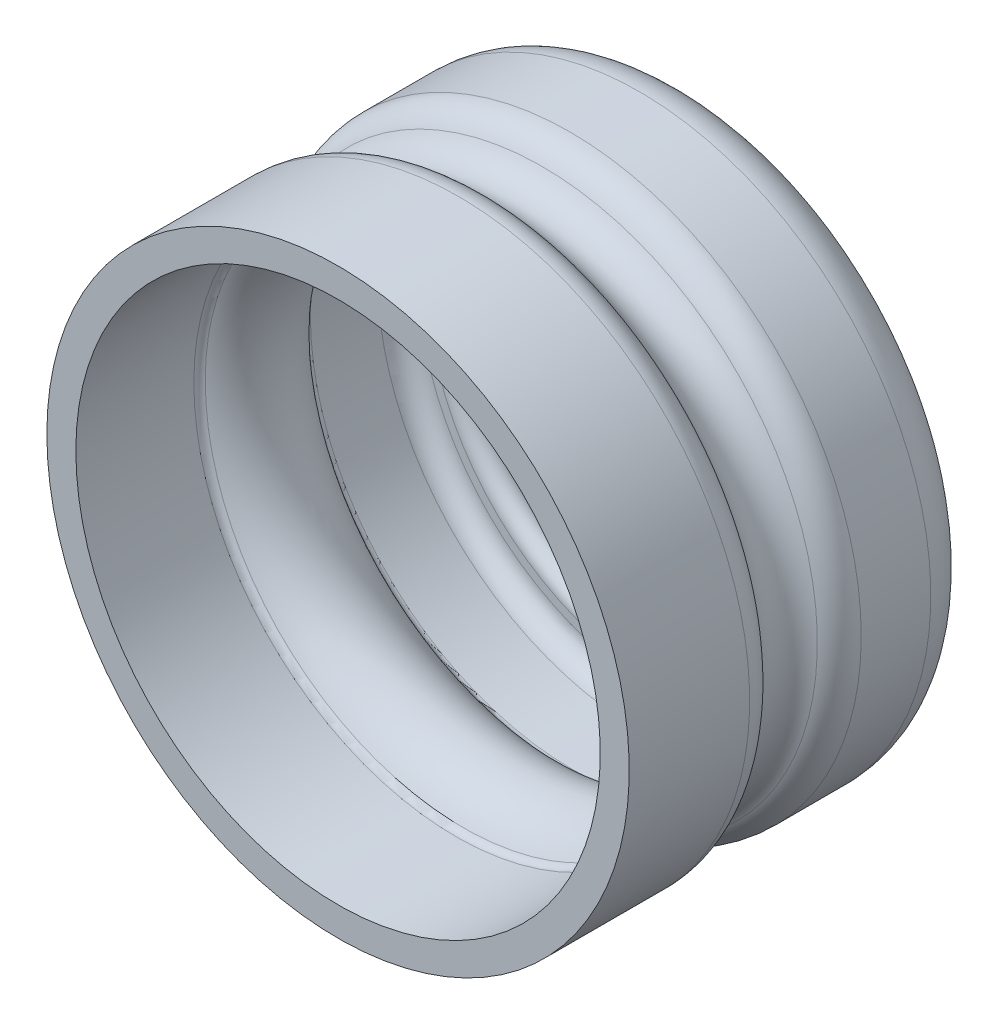
ISO-10303-21;
HEADER;
FILE_DESCRIPTION(('STEP AP214'),'2;1');
FILE_NAME('part.step','',(''),(''),'','','');
FILE_SCHEMA(('AUTOMOTIVE_DESIGN { 1 0 10303 214 1 1 1 1 }'));
ENDSEC;
DATA;
#1=APPLICATION_CONTEXT('core data for automotive mechanical design processes');
#2=APPLICATION_PROTOCOL_DEFINITION('international standard','automotive_design',2000,#1);
#3=PRODUCT_CONTEXT('',#1,'mechanical');
#4=PRODUCT('Part','Part','',(#3));
#5=PRODUCT_RELATED_PRODUCT_CATEGORY('part','',(#4));
#6=PRODUCT_DEFINITION_FORMATION('','',#4);
#7=PRODUCT_DEFINITION_CONTEXT('part definition',#1,'design');
#8=PRODUCT_DEFINITION('design','',#6,#7);
#9=PRODUCT_DEFINITION_SHAPE('','',#8);
#10=(LENGTH_UNIT() NAMED_UNIT(*) SI_UNIT(.MILLI.,.METRE.));
#11=(NAMED_UNIT(*) PLANE_ANGLE_UNIT() SI_UNIT($,.RADIAN.));
#12=(NAMED_UNIT(*) SI_UNIT($,.STERADIAN.) SOLID_ANGLE_UNIT());
#13=UNCERTAINTY_MEASURE_WITH_UNIT(LENGTH_MEASURE(1.E-05),#10,'distance_accuracy_value','');
#14=(GEOMETRIC_REPRESENTATION_CONTEXT(3) GLOBAL_UNCERTAINTY_ASSIGNED_CONTEXT((#13)) GLOBAL_UNIT_ASSIGNED_CONTEXT((#10,
#11,#12)) REPRESENTATION_CONTEXT('',''));
#15=CARTESIAN_POINT('',(0.,0.,0.));
#16=DIRECTION('',(0.,0.,1.));
#17=DIRECTION('',(1.,0.,0.));
#18=AXIS2_PLACEMENT_3D('',#15,#16,#17);
#19=CARTESIAN_POINT('',(0.83,0.,-1.15));
#20=DIRECTION('',(0.,0.,-1.));
#21=DIRECTION('',(-1.,0.,0.));
#22=AXIS2_PLACEMENT_3D('',#19,#20,#21);
#23=PLANE('',#22);
#24=CARTESIAN_POINT('',(0.,0.,-1.15));
#25=DIRECTION('',(0.,0.,-1.));
#26=DIRECTION('',(-1.,0.,0.));
#27=AXIS2_PLACEMENT_3D('',#24,#25,#26);
#28=CIRCLE('',#27,0.83);
#29=CARTESIAN_POINT('',(-0.83,0.,-1.15));
#30=VERTEX_POINT('',#29);
#31=EDGE_CURVE('E64',#30,#30,#28,.F.);
#32=ORIENTED_EDGE('',*,*,#31,.T.);
#33=EDGE_LOOP('',(#32));
#34=FACE_BOUND('',#33,.T.);
#35=CARTESIAN_POINT('',(0.,0.,-1.15));
#36=DIRECTION('',(0.,0.,-1.));
#37=DIRECTION('',(-1.,0.,0.));
#38=AXIS2_PLACEMENT_3D('',#35,#36,#37);
#39=CIRCLE('',#38,0.8);
#40=CARTESIAN_POINT('',(-0.8,0.,-1.15));
#41=VERTEX_POINT('',#40);
#42=EDGE_CURVE('E18',#41,#41,#39,.F.);
#43=ORIENTED_EDGE('',*,*,#42,.F.);
#44=EDGE_LOOP('',(#43));
#45=FACE_BOUND('',#44,.T.);
#46=ADVANCED_FACE('F14',(#34,#45),#23,.F.);
#47=CARTESIAN_POINT('',(0.,0.,-1.2));
#48=DIRECTION('',(0.,0.,-1.));
#49=DIRECTION('',(-1.,0.,0.));
#50=AXIS2_PLACEMENT_3D('',#47,#48,#49);
#51=TOROIDAL_SURFACE('',#50,0.8,0.0499999999999999);
#52=CARTESIAN_POINT('',(0.,0.,-1.25));
#53=DIRECTION('',(0.,0.,-1.));
#54=DIRECTION('',(-1.,0.,0.));
#55=AXIS2_PLACEMENT_3D('',#52,#53,#54);
#56=CIRCLE('',#55,0.8);
#57=CARTESIAN_POINT('',(-0.8,0.,-1.25));
#58=VERTEX_POINT('',#57);
#59=EDGE_CURVE('E56',#58,#58,#56,.T.);
#60=ORIENTED_EDGE('',*,*,#59,.T.);
#61=EDGE_LOOP('',(#60));
#62=FACE_BOUND('',#61,.T.);
#63=ORIENTED_EDGE('',*,*,#42,.T.);
#64=EDGE_LOOP('',(#63));
#65=FACE_BOUND('',#64,.T.);
#66=ADVANCED_FACE('F71',(#62,#65),#51,.T.);
#67=CARTESIAN_POINT('',(0.,0.,-1.08));
#68=DIRECTION('',(0.,0.,-1.));
#69=DIRECTION('',(-1.,0.,0.));
#70=AXIS2_PLACEMENT_3D('',#67,#68,#69);
#71=TOROIDAL_SURFACE('',#70,0.83,0.07);
#72=ORIENTED_EDGE('',*,*,#31,.F.);
#73=EDGE_LOOP('',(#72));
#74=FACE_BOUND('',#73,.T.);
#75=CARTESIAN_POINT('',(0.,0.,-1.08));
#76=DIRECTION('',(0.,0.,-1.));
#77=DIRECTION('',(-1.,0.,0.));
#78=AXIS2_PLACEMENT_3D('',#75,#76,#77);
#79=CIRCLE('',#78,0.9);
#80=CARTESIAN_POINT('',(-0.9,0.,-1.08));
#81=VERTEX_POINT('',#80);
#82=EDGE_CURVE('E53',#81,#81,#79,.F.);
#83=ORIENTED_EDGE('',*,*,#82,.T.);
#84=EDGE_LOOP('',(#83));
#85=FACE_BOUND('',#84,.T.);
#86=ADVANCED_FACE('F79',(#74,#85),#71,.F.);
#87=CARTESIAN_POINT('',(0.83,0.,-1.25));
#88=DIRECTION('',(0.,0.,1.));
#89=DIRECTION('',(1.,0.,0.));
#90=AXIS2_PLACEMENT_3D('',#87,#88,#89);
#91=PLANE('',#90);
#92=ORIENTED_EDGE('',*,*,#59,.F.);
#93=EDGE_LOOP('',(#92));
#94=FACE_BOUND('',#93,.T.);
#95=CARTESIAN_POINT('',(0.,0.,-1.25));
#96=DIRECTION('',(0.,0.,-1.));
#97=DIRECTION('',(-1.,0.,0.));
#98=AXIS2_PLACEMENT_3D('',#95,#96,#97);
#99=CIRCLE('',#98,0.83);
#100=CARTESIAN_POINT('',(-0.83,0.,-1.25));
#101=VERTEX_POINT('',#100);
#102=EDGE_CURVE('E52',#101,#101,#99,.F.);
#103=ORIENTED_EDGE('',*,*,#102,.F.);
#104=EDGE_LOOP('',(#103));
#105=FACE_BOUND('',#104,.T.);
#106=ADVANCED_FACE('F111',(#94,#105),#91,.F.);
#107=CARTESIAN_POINT('',(0.,0.,-1.5));
#108=DIRECTION('',(0.,0.,-1.));
#109=DIRECTION('',(-1.,0.,0.));
#110=AXIS2_PLACEMENT_3D('',#107,#108,#109);
#111=CYLINDRICAL_SURFACE('',#110,0.9);
#112=ORIENTED_EDGE('',*,*,#82,.F.);
#113=EDGE_LOOP('',(#112));
#114=FACE_BOUND('',#113,.T.);
#115=CARTESIAN_POINT('',(0.,0.,-0.849220702149));
#116=DIRECTION('',(0.,0.,1.));
#117=DIRECTION('',(1.,0.,0.));
#118=AXIS2_PLACEMENT_3D('',#115,#116,#117);
#119=CIRCLE('',#118,0.9);
#120=CARTESIAN_POINT('',(0.9,0.,-0.849220702149));
#121=VERTEX_POINT('',#120);
#122=EDGE_CURVE('E49',#121,#121,#119,.T.);
#123=ORIENTED_EDGE('',*,*,#122,.T.);
#124=EDGE_LOOP('',(#123));
#125=FACE_BOUND('',#124,.T.);
#126=ADVANCED_FACE('F108',(#114,#125),#111,.F.);
#127=CARTESIAN_POINT('',(0.,0.,-1.08));
#128=DIRECTION('',(0.,0.,-1.));
#129=DIRECTION('',(-1.,0.,0.));
#130=AXIS2_PLACEMENT_3D('',#127,#128,#129);
#131=TOROIDAL_SURFACE('',#130,0.83,0.17);
#132=CARTESIAN_POINT('',(0.,0.,-1.08));
#133=DIRECTION('',(0.,0.,-1.));
#134=DIRECTION('',(-1.,0.,0.));
#135=AXIS2_PLACEMENT_3D('',#132,#133,#134);
#136=CIRCLE('',#135,1.);
#137=CARTESIAN_POINT('',(-1.,0.,-1.08));
#138=VERTEX_POINT('',#137);
#139=EDGE_CURVE('E48',#138,#138,#136,.F.);
#140=ORIENTED_EDGE('',*,*,#139,.F.);
#141=EDGE_LOOP('',(#140));
#142=FACE_BOUND('',#141,.T.);
#143=ORIENTED_EDGE('',*,*,#102,.T.);
#144=EDGE_LOOP('',(#143));
#145=FACE_BOUND('',#144,.T.);
#146=ADVANCED_FACE('F110',(#142,#145),#131,.T.);
#147=CARTESIAN_POINT('',(0.,0.,-0.849220702149));
#148=DIRECTION('',(0.,0.,-1.));
#149=DIRECTION('',(-1.,0.,0.));
#150=AXIS2_PLACEMENT_3D('',#147,#148,#149);
#151=TOROIDAL_SURFACE('',#150,0.87,0.0300000000000001);
#152=ORIENTED_EDGE('',*,*,#122,.F.);
#153=EDGE_LOOP('',(#152));
#154=FACE_BOUND('',#153,.T.);
#155=CARTESIAN_POINT('',(0.,0.,-0.823969154231841));
#156=DIRECTION('',(0.,0.,-1.));
#157=DIRECTION('',(0.,1.,0.));
#158=AXIS2_PLACEMENT_3D('',#155,#156,#157);
#159=CIRCLE('',#158,0.886197509926102);
#160=CARTESIAN_POINT('',(0.,0.886197509926102,-0.823969154231841));
#161=VERTEX_POINT('',#160);
#162=EDGE_CURVE('E38',#161,#161,#159,.T.);
#163=ORIENTED_EDGE('',*,*,#162,.F.);
#164=EDGE_LOOP('',(#163));
#165=FACE_BOUND('',#164,.T.);
#166=ADVANCED_FACE('F106',(#154,#165),#151,.F.);
#167=CARTESIAN_POINT('',(0.,0.,-1.5));
#168=DIRECTION('',(0.,0.,-1.));
#169=DIRECTION('',(-1.,0.,0.));
#170=AXIS2_PLACEMENT_3D('',#167,#168,#169);
#171=CYLINDRICAL_SURFACE('',#170,1.);
#172=CARTESIAN_POINT('',(0.,0.,-0.840974000000004));
#173=DIRECTION('',(0.,0.,1.));
#174=DIRECTION('',(1.,0.,0.));
#175=AXIS2_PLACEMENT_3D('',#172,#173,#174);
#176=CIRCLE('',#175,1.00000000000025);
#177=CARTESIAN_POINT('',(1.00000000000025,0.,-0.840974000000004));
#178=VERTEX_POINT('',#177);
#179=EDGE_CURVE('E35',#178,#178,#176,.T.);
#180=ORIENTED_EDGE('',*,*,#179,.F.);
#181=EDGE_LOOP('',(#180));
#182=FACE_BOUND('',#181,.T.);
#183=ORIENTED_EDGE('',*,*,#139,.T.);
#184=EDGE_LOOP('',(#183));
#185=FACE_BOUND('',#184,.T.);
#186=ADVANCED_FACE('F102',(#182,#185),#171,.T.);
#187=CARTESIAN_POINT('',(0.,0.,-0.649577593694));
#188=DIRECTION('',(0.,0.,-1.));
#189=DIRECTION('',(-1.,0.,0.));
#190=AXIS2_PLACEMENT_3D('',#187,#188,#189);
#191=TOROIDAL_SURFACE('',#190,0.998060316991,0.2071851925);
#192=ORIENTED_EDGE('',*,*,#162,.T.);
#193=EDGE_LOOP('',(#192));
#194=FACE_BOUND('',#193,.T.);
#195=CARTESIAN_POINT('',(0.,0.,-0.474911196050667));
#196=DIRECTION('',(0.,0.,1.));
#197=DIRECTION('',(1.,0.,0.));
#198=AXIS2_PLACEMENT_3D('',#195,#196,#197);
#199=CIRCLE('',#198,0.886627137346872);
#200=CARTESIAN_POINT('',(0.886627137346872,0.,-0.474911196050667));
#201=VERTEX_POINT('',#200);
#202=EDGE_CURVE('E34',#201,#201,#199,.T.);
#203=ORIENTED_EDGE('',*,*,#202,.T.);
#204=EDGE_LOOP('',(#203));
#205=FACE_BOUND('',#204,.T.);
#206=ADVANCED_FACE('F105',(#194,#205),#191,.T.);
#207=CARTESIAN_POINT('',(0.,0.,-0.449619852272001));
#208=DIRECTION('',(0.,0.,-1.));
#209=DIRECTION('',(-1.,0.,0.));
#210=AXIS2_PLACEMENT_3D('',#207,#208,#209);
#211=TOROIDAL_SURFACE('',#210,0.870491836610001,0.0299999999999987);
#212=ORIENTED_EDGE('',*,*,#202,.F.);
#213=EDGE_LOOP('',(#212));
#214=FACE_BOUND('',#213,.T.);
#215=CARTESIAN_POINT('',(0.,0.,-0.449619852272));
#216=DIRECTION('',(0.,0.,-1.));
#217=DIRECTION('',(-1.,0.,0.));
#218=AXIS2_PLACEMENT_3D('',#215,#216,#217);
#219=CIRCLE('',#218,0.90049183661);
#220=CARTESIAN_POINT('',(-0.90049183661,0.,-0.449619852272));
#221=VERTEX_POINT('',#220);
#222=EDGE_CURVE('E30',#221,#221,#219,.F.);
#223=ORIENTED_EDGE('',*,*,#222,.T.);
#224=EDGE_LOOP('',(#223));
#225=FACE_BOUND('',#224,.T.);
#226=ADVANCED_FACE('F136',(#214,#225),#211,.F.);
#227=CARTESIAN_POINT('',(0.,0.,-0.839159532437001));
#228=DIRECTION('',(0.,0.,-1.));
#229=DIRECTION('',(-1.,0.,0.));
#230=AXIS2_PLACEMENT_3D('',#227,#228,#229);
#231=TOROIDAL_SURFACE('',#230,0.893134120771,0.106881281972);
#232=ORIENTED_EDGE('',*,*,#179,.T.);
#233=EDGE_LOOP('',(#232));
#234=FACE_BOUND('',#233,.T.);
#235=CARTESIAN_POINT('',(0.,0.,-0.745580441951782));
#236=DIRECTION('',(0.,0.,-1.));
#237=DIRECTION('',(-1.,0.,0.));
#238=AXIS2_PLACEMENT_3D('',#235,#236,#237);
#239=CIRCLE('',#238,0.944772887795551);
#240=CARTESIAN_POINT('',(-0.944772887795551,0.,-0.745580441951782));
#241=VERTEX_POINT('',#240);
#242=EDGE_CURVE('E33',#241,#241,#239,.T.);
#243=ORIENTED_EDGE('',*,*,#242,.T.);
#244=EDGE_LOOP('',(#243));
#245=FACE_BOUND('',#244,.T.);
#246=ADVANCED_FACE('F100',(#234,#245),#231,.T.);
#247=CARTESIAN_POINT('',(0.,0.,-1.5));
#248=DIRECTION('',(0.,0.,-1.));
#249=DIRECTION('',(-1.,0.,0.));
#250=AXIS2_PLACEMENT_3D('',#247,#248,#249);
#251=CYLINDRICAL_SURFACE('',#250,0.90049183661);
#252=ORIENTED_EDGE('',*,*,#222,.F.);
#253=EDGE_LOOP('',(#252));
#254=FACE_BOUND('',#253,.T.);
#255=CARTESIAN_POINT('',(0.,0.,-0.0443367110743102));
#256=DIRECTION('',(0.,0.,-1.));
#257=DIRECTION('',(-1.,0.,0.));
#258=AXIS2_PLACEMENT_3D('',#255,#256,#257);
#259=CIRCLE('',#258,0.90049183661);
#260=CARTESIAN_POINT('',(-0.90049183661,0.,-0.0443367110743101));
#261=VERTEX_POINT('',#260);
#262=EDGE_CURVE('E41',#261,#261,#259,.F.);
#263=ORIENTED_EDGE('',*,*,#262,.T.);
#264=EDGE_LOOP('',(#263));
#265=FACE_BOUND('',#264,.T.);
#266=ADVANCED_FACE('F97',(#254,#265),#251,.F.);
#267=CARTESIAN_POINT('',(0.,0.,-0.649395798396));
#268=DIRECTION('',(0.,0.,-1.));
#269=DIRECTION('',(-1.,0.,0.));
#270=AXIS2_PLACEMENT_3D('',#267,#268,#269);
#271=TOROIDAL_SURFACE('',#270,1.,0.110912215641);
#272=CARTESIAN_POINT('',(0.,0.,-0.553211154839821));
#273=DIRECTION('',(0.,0.,1.));
#274=DIRECTION('',(1.,0.,0.));
#275=AXIS2_PLACEMENT_3D('',#272,#273,#274);
#276=CIRCLE('',#275,0.944772887796012);
#277=CARTESIAN_POINT('',(0.944772887796012,0.,-0.553211154839822));
#278=VERTEX_POINT('',#277);
#279=EDGE_CURVE('E27',#278,#278,#276,.T.);
#280=ORIENTED_EDGE('',*,*,#279,.F.);
#281=EDGE_LOOP('',(#280));
#282=FACE_BOUND('',#281,.T.);
#283=ORIENTED_EDGE('',*,*,#242,.F.);
#284=EDGE_LOOP('',(#283));
#285=FACE_BOUND('',#284,.T.);
#286=ADVANCED_FACE('F95',(#282,#285),#271,.F.);
#287=CARTESIAN_POINT('',(0.90049183661,0.,-0.04433671107431));
#288=DIRECTION('',(0.,0.,-1.));
#289=DIRECTION('',(-1.,0.,0.));
#290=AXIS2_PLACEMENT_3D('',#287,#288,#289);
#291=PLANE('',#290);
#292=CARTESIAN_POINT('',(0.,0.,-0.0443367110743097));
#293=DIRECTION('',(0.,0.,-1.));
#294=DIRECTION('',(-1.,0.,0.));
#295=AXIS2_PLACEMENT_3D('',#292,#293,#294);
#296=CIRCLE('',#295,1.);
#297=CARTESIAN_POINT('',(-1.,0.,-0.0443367110743096));
#298=VERTEX_POINT('',#297);
#299=EDGE_CURVE('E22',#298,#298,#296,.T.);
#300=ORIENTED_EDGE('',*,*,#299,.F.);
#301=EDGE_LOOP('',(#300));
#302=FACE_BOUND('',#301,.T.);
#303=ORIENTED_EDGE('',*,*,#262,.F.);
#304=EDGE_LOOP('',(#303));
#305=FACE_BOUND('',#304,.T.);
#306=ADVANCED_FACE('F90',(#302,#305),#291,.F.);
#307=CARTESIAN_POINT('',(0.,0.,-0.457817597602001));
#308=DIRECTION('',(0.,0.,-1.));
#309=DIRECTION('',(-1.,0.,0.));
#310=AXIS2_PLACEMENT_3D('',#307,#308,#309);
#311=TOROIDAL_SURFACE('',#310,0.89,0.11);
#312=CARTESIAN_POINT('',(0.,0.,-0.457817597602));
#313=DIRECTION('',(0.,0.,-1.));
#314=DIRECTION('',(-1.,0.,0.));
#315=AXIS2_PLACEMENT_3D('',#312,#313,#314);
#316=CIRCLE('',#315,1.);
#317=CARTESIAN_POINT('',(-1.,0.,-0.457817597602));
#318=VERTEX_POINT('',#317);
#319=EDGE_CURVE('E10',#318,#318,#316,.F.);
#320=ORIENTED_EDGE('',*,*,#319,.F.);
#321=EDGE_LOOP('',(#320));
#322=FACE_BOUND('',#321,.T.);
#323=ORIENTED_EDGE('',*,*,#279,.T.);
#324=EDGE_LOOP('',(#323));
#325=FACE_BOUND('',#324,.T.);
#326=ADVANCED_FACE('F16',(#322,#325),#311,.T.);
#327=CARTESIAN_POINT('',(0.,0.,-1.5));
#328=DIRECTION('',(0.,0.,-1.));
#329=DIRECTION('',(-1.,0.,0.));
#330=AXIS2_PLACEMENT_3D('',#327,#328,#329);
#331=CYLINDRICAL_SURFACE('',#330,1.);
#332=ORIENTED_EDGE('',*,*,#299,.T.);
#333=EDGE_LOOP('',(#332));
#334=FACE_BOUND('',#333,.T.);
#335=ORIENTED_EDGE('',*,*,#319,.T.);
#336=EDGE_LOOP('',(#335));
#337=FACE_BOUND('',#336,.T.);
#338=ADVANCED_FACE('F83',(#334,#337),#331,.T.);
#339=CLOSED_SHELL('',(#46,#66,#86,#106,#126,#146,#166,#186,#206,#226,#246,#266,#286,#306,#326,#338));
#340=MANIFOLD_SOLID_BREP('B1',#339);
#341=ADVANCED_BREP_SHAPE_REPRESENTATION('',(#18,#340),#14);
#342=SHAPE_DEFINITION_REPRESENTATION(#9,#341);
ENDSEC;
END-ISO-10303-21;
